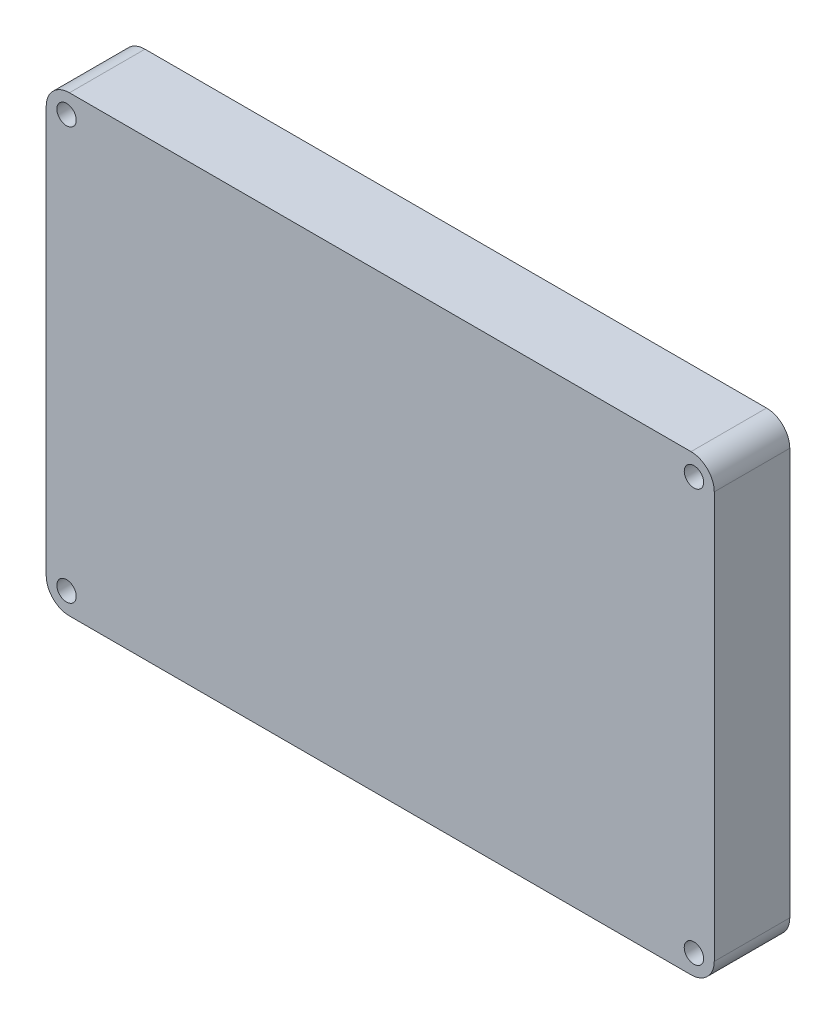
ISO-10303-21;
HEADER;
FILE_DESCRIPTION(('STEP AP214'),'2;1');
FILE_NAME('part.step','',(''),(''),'','','');
FILE_SCHEMA(('AUTOMOTIVE_DESIGN { 1 0 10303 214 1 1 1 1 }'));
ENDSEC;
DATA;
#1=APPLICATION_CONTEXT('core data for automotive mechanical design processes');
#2=APPLICATION_PROTOCOL_DEFINITION('international standard','automotive_design',2000,#1);
#3=PRODUCT_CONTEXT('',#1,'mechanical');
#4=PRODUCT('Part','Part','',(#3));
#5=PRODUCT_RELATED_PRODUCT_CATEGORY('part','',(#4));
#6=PRODUCT_DEFINITION_FORMATION('','',#4);
#7=PRODUCT_DEFINITION_CONTEXT('part definition',#1,'design');
#8=PRODUCT_DEFINITION('design','',#6,#7);
#9=PRODUCT_DEFINITION_SHAPE('','',#8);
#10=(LENGTH_UNIT() NAMED_UNIT(*) SI_UNIT(.MILLI.,.METRE.));
#11=(NAMED_UNIT(*) PLANE_ANGLE_UNIT() SI_UNIT($,.RADIAN.));
#12=(NAMED_UNIT(*) SI_UNIT($,.STERADIAN.) SOLID_ANGLE_UNIT());
#13=UNCERTAINTY_MEASURE_WITH_UNIT(LENGTH_MEASURE(1.E-05),#10,'distance_accuracy_value','');
#14=(GEOMETRIC_REPRESENTATION_CONTEXT(3) GLOBAL_UNCERTAINTY_ASSIGNED_CONTEXT((#13)) GLOBAL_UNIT_ASSIGNED_CONTEXT((#10,
#11,#12)) REPRESENTATION_CONTEXT('',''));
#15=CARTESIAN_POINT('',(0.,0.,0.));
#16=DIRECTION('',(0.,0.,1.));
#17=DIRECTION('',(1.,0.,0.));
#18=AXIS2_PLACEMENT_3D('',#15,#16,#17);
#19=CARTESIAN_POINT('',(0.,0.,13.));
#20=DIRECTION('',(0.,0.,1.));
#21=DIRECTION('',(1.,0.,0.));
#22=AXIS2_PLACEMENT_3D('',#19,#20,#21);
#23=PLANE('',#22);
#24=CARTESIAN_POINT('',(-3.50000000000003,3.49999999999999,13.));
#25=DIRECTION('',(0.,0.,1.));
#26=DIRECTION('',(1.,0.,0.));
#27=AXIS2_PLACEMENT_3D('',#24,#25,#26);
#28=CIRCLE('',#27,1.67000000000001);
#29=CARTESIAN_POINT('',(-5.17000000000004,3.49999999999999,13.));
#30=VERTEX_POINT('',#29);
#31=EDGE_CURVE('E190',#30,#30,#28,.T.);
#32=ORIENTED_EDGE('',*,*,#31,.F.);
#33=EDGE_LOOP('',(#32));
#34=FACE_BOUND('',#33,.T.);
#35=CARTESIAN_POINT('',(-111.5,74.5,13.));
#36=DIRECTION('',(0.,0.,1.));
#37=DIRECTION('',(1.,0.,0.));
#38=AXIS2_PLACEMENT_3D('',#35,#36,#37);
#39=CIRCLE('',#38,1.67000000000001);
#40=CARTESIAN_POINT('',(-113.17,74.5,13.));
#41=VERTEX_POINT('',#40);
#42=EDGE_CURVE('E136',#41,#41,#39,.T.);
#43=ORIENTED_EDGE('',*,*,#42,.F.);
#44=EDGE_LOOP('',(#43));
#45=FACE_BOUND('',#44,.T.);
#46=DIRECTION('',(0.,-1.,0.));
#47=VECTOR('',#46,1.);
#48=CARTESIAN_POINT('',(-115.,78.,13.));
#49=LINE('',#48,#47);
#50=CARTESIAN_POINT('',(-115.,74.,13.));
#51=VERTEX_POINT('',#50);
#52=CARTESIAN_POINT('',(-115.,4.,13.));
#53=VERTEX_POINT('',#52);
#54=EDGE_CURVE('E141',#51,#53,#49,.T.);
#55=ORIENTED_EDGE('',*,*,#54,.T.);
#56=CARTESIAN_POINT('',(-111.,4.,13.));
#57=DIRECTION('',(0.,0.,1.));
#58=DIRECTION('',(1.,0.,0.));
#59=AXIS2_PLACEMENT_3D('',#56,#57,#58);
#60=CIRCLE('',#59,4.);
#61=CARTESIAN_POINT('',(-111.,0.,13.));
#62=VERTEX_POINT('',#61);
#63=EDGE_CURVE('E156',#53,#62,#60,.T.);
#64=ORIENTED_EDGE('',*,*,#63,.T.);
#65=DIRECTION('',(1.,0.,0.));
#66=VECTOR('',#65,1.);
#67=CARTESIAN_POINT('',(-115.,0.,13.));
#68=LINE('',#67,#66);
#69=CARTESIAN_POINT('',(-4.00000000000003,0.,13.));
#70=VERTEX_POINT('',#69);
#71=EDGE_CURVE('E123',#62,#70,#68,.T.);
#72=ORIENTED_EDGE('',*,*,#71,.T.);
#73=CARTESIAN_POINT('',(-4.,4.,13.));
#74=DIRECTION('',(0.,0.,1.));
#75=DIRECTION('',(1.,0.,0.));
#76=AXIS2_PLACEMENT_3D('',#73,#74,#75);
#77=CIRCLE('',#76,4.);
#78=CARTESIAN_POINT('',(0.,4.,13.));
#79=VERTEX_POINT('',#78);
#80=EDGE_CURVE('E154',#70,#79,#77,.T.);
#81=ORIENTED_EDGE('',*,*,#80,.T.);
#82=DIRECTION('',(0.,1.,0.));
#83=VECTOR('',#82,1.);
#84=CARTESIAN_POINT('',(0.,78.,13.));
#85=LINE('',#84,#83);
#86=CARTESIAN_POINT('',(0.,74.,13.));
#87=VERTEX_POINT('',#86);
#88=EDGE_CURVE('E167',#79,#87,#85,.T.);
#89=ORIENTED_EDGE('',*,*,#88,.T.);
#90=CARTESIAN_POINT('',(-4.,74.,13.));
#91=DIRECTION('',(0.,0.,1.));
#92=DIRECTION('',(1.,0.,0.));
#93=AXIS2_PLACEMENT_3D('',#90,#91,#92);
#94=CIRCLE('',#93,4.);
#95=CARTESIAN_POINT('',(-4.00000000000003,78.,13.));
#96=VERTEX_POINT('',#95);
#97=EDGE_CURVE('E58',#87,#96,#94,.T.);
#98=ORIENTED_EDGE('',*,*,#97,.T.);
#99=DIRECTION('',(-1.,0.,0.));
#100=VECTOR('',#99,1.);
#101=CARTESIAN_POINT('',(-115.,78.,13.));
#102=LINE('',#101,#100);
#103=CARTESIAN_POINT('',(-111.,78.,13.));
#104=VERTEX_POINT('',#103);
#105=EDGE_CURVE('E142',#96,#104,#102,.T.);
#106=ORIENTED_EDGE('',*,*,#105,.T.);
#107=CARTESIAN_POINT('',(-111.,74.,13.));
#108=DIRECTION('',(0.,0.,1.));
#109=DIRECTION('',(1.,0.,0.));
#110=AXIS2_PLACEMENT_3D('',#107,#108,#109);
#111=CIRCLE('',#110,4.);
#112=EDGE_CURVE('E151',#104,#51,#111,.T.);
#113=ORIENTED_EDGE('',*,*,#112,.T.);
#114=EDGE_LOOP('',(#55,#64,#72,#81,#89,#98,#106,#113));
#115=FACE_BOUND('',#114,.T.);
#116=CARTESIAN_POINT('',(-3.50000000000003,74.5,13.));
#117=DIRECTION('',(0.,0.,1.));
#118=DIRECTION('',(-1.,0.,0.));
#119=AXIS2_PLACEMENT_3D('',#116,#117,#118);
#120=CIRCLE('',#119,1.67000000000001);
#121=CARTESIAN_POINT('',(-5.17000000000004,74.5,13.));
#122=VERTEX_POINT('',#121);
#123=EDGE_CURVE('E184',#122,#122,#120,.T.);
#124=ORIENTED_EDGE('',*,*,#123,.F.);
#125=EDGE_LOOP('',(#124));
#126=FACE_BOUND('',#125,.T.);
#127=CARTESIAN_POINT('',(-111.5,3.5,13.));
#128=DIRECTION('',(0.,0.,1.));
#129=DIRECTION('',(-1.,0.,0.));
#130=AXIS2_PLACEMENT_3D('',#127,#128,#129);
#131=CIRCLE('',#130,1.67000000000001);
#132=CARTESIAN_POINT('',(-113.17,3.5,13.));
#133=VERTEX_POINT('',#132);
#134=EDGE_CURVE('E196',#133,#133,#131,.T.);
#135=ORIENTED_EDGE('',*,*,#134,.F.);
#136=EDGE_LOOP('',(#135));
#137=FACE_BOUND('',#136,.T.);
#138=ADVANCED_FACE('F37',(#34,#45,#115,#126,#137),#23,.T.);
#139=CARTESIAN_POINT('',(0.,0.,0.));
#140=DIRECTION('',(0.,0.,1.));
#141=DIRECTION('',(1.,0.,0.));
#142=AXIS2_PLACEMENT_3D('',#139,#140,#141);
#143=PLANE('',#142);
#144=DIRECTION('',(1.,0.,0.));
#145=VECTOR('',#144,1.);
#146=CARTESIAN_POINT('',(-115.,0.,0.));
#147=LINE('',#146,#145);
#148=CARTESIAN_POINT('',(-111.,0.,0.));
#149=VERTEX_POINT('',#148);
#150=CARTESIAN_POINT('',(-4.00000000000003,0.,0.));
#151=VERTEX_POINT('',#150);
#152=EDGE_CURVE('E120',#149,#151,#147,.T.);
#153=ORIENTED_EDGE('',*,*,#152,.F.);
#154=CARTESIAN_POINT('',(-111.,4.,0.));
#155=DIRECTION('',(0.,0.,1.));
#156=DIRECTION('',(1.,0.,0.));
#157=AXIS2_PLACEMENT_3D('',#154,#155,#156);
#158=CIRCLE('',#157,4.);
#159=CARTESIAN_POINT('',(-115.,4.,0.));
#160=VERTEX_POINT('',#159);
#161=EDGE_CURVE('E103',#149,#160,#158,.F.);
#162=ORIENTED_EDGE('',*,*,#161,.T.);
#163=DIRECTION('',(0.,-1.,0.));
#164=VECTOR('',#163,1.);
#165=CARTESIAN_POINT('',(-115.,78.,0.));
#166=LINE('',#165,#164);
#167=CARTESIAN_POINT('',(-115.,74.,0.));
#168=VERTEX_POINT('',#167);
#169=EDGE_CURVE('E131',#168,#160,#166,.T.);
#170=ORIENTED_EDGE('',*,*,#169,.F.);
#171=CARTESIAN_POINT('',(-111.,74.,0.));
#172=DIRECTION('',(0.,0.,1.));
#173=DIRECTION('',(1.,0.,0.));
#174=AXIS2_PLACEMENT_3D('',#171,#172,#173);
#175=CIRCLE('',#174,4.);
#176=CARTESIAN_POINT('',(-111.,78.,0.));
#177=VERTEX_POINT('',#176);
#178=EDGE_CURVE('E124',#168,#177,#175,.F.);
#179=ORIENTED_EDGE('',*,*,#178,.T.);
#180=DIRECTION('',(-1.,0.,0.));
#181=VECTOR('',#180,1.);
#182=CARTESIAN_POINT('',(-115.,78.,0.));
#183=LINE('',#182,#181);
#184=CARTESIAN_POINT('',(-4.00000000000003,78.,0.));
#185=VERTEX_POINT('',#184);
#186=EDGE_CURVE('E134',#185,#177,#183,.T.);
#187=ORIENTED_EDGE('',*,*,#186,.F.);
#188=CARTESIAN_POINT('',(-4.,74.,0.));
#189=DIRECTION('',(0.,0.,1.));
#190=DIRECTION('',(1.,0.,0.));
#191=AXIS2_PLACEMENT_3D('',#188,#189,#190);
#192=CIRCLE('',#191,4.);
#193=CARTESIAN_POINT('',(0.,74.,0.));
#194=VERTEX_POINT('',#193);
#195=EDGE_CURVE('E145',#185,#194,#192,.F.);
#196=ORIENTED_EDGE('',*,*,#195,.T.);
#197=DIRECTION('',(0.,1.,0.));
#198=VECTOR('',#197,1.);
#199=CARTESIAN_POINT('',(0.,78.,0.));
#200=LINE('',#199,#198);
#201=CARTESIAN_POINT('',(0.,4.,0.));
#202=VERTEX_POINT('',#201);
#203=EDGE_CURVE('E130',#202,#194,#200,.T.);
#204=ORIENTED_EDGE('',*,*,#203,.F.);
#205=CARTESIAN_POINT('',(-4.,4.,0.));
#206=DIRECTION('',(0.,0.,1.));
#207=DIRECTION('',(1.,0.,0.));
#208=AXIS2_PLACEMENT_3D('',#205,#206,#207);
#209=CIRCLE('',#208,4.);
#210=EDGE_CURVE('E114',#202,#151,#209,.F.);
#211=ORIENTED_EDGE('',*,*,#210,.T.);
#212=EDGE_LOOP('',(#153,#162,#170,#179,#187,#196,#204,#211));
#213=FACE_BOUND('',#212,.T.);
#214=CARTESIAN_POINT('',(-111.5,74.5,0.));
#215=DIRECTION('',(0.,0.,1.));
#216=DIRECTION('',(1.,0.,0.));
#217=AXIS2_PLACEMENT_3D('',#214,#215,#216);
#218=CIRCLE('',#217,1.67000000000001);
#219=CARTESIAN_POINT('',(-113.17,74.5,0.));
#220=VERTEX_POINT('',#219);
#221=EDGE_CURVE('E181',#220,#220,#218,.T.);
#222=ORIENTED_EDGE('',*,*,#221,.T.);
#223=EDGE_LOOP('',(#222));
#224=FACE_BOUND('',#223,.T.);
#225=CARTESIAN_POINT('',(-3.50000000000003,74.5,0.));
#226=DIRECTION('',(0.,0.,1.));
#227=DIRECTION('',(-1.,0.,0.));
#228=AXIS2_PLACEMENT_3D('',#225,#226,#227);
#229=CIRCLE('',#228,1.67000000000001);
#230=CARTESIAN_POINT('',(-5.17000000000004,74.5,0.));
#231=VERTEX_POINT('',#230);
#232=EDGE_CURVE('E187',#231,#231,#229,.T.);
#233=ORIENTED_EDGE('',*,*,#232,.T.);
#234=EDGE_LOOP('',(#233));
#235=FACE_BOUND('',#234,.T.);
#236=CARTESIAN_POINT('',(-3.50000000000003,3.49999999999999,0.));
#237=DIRECTION('',(0.,0.,1.));
#238=DIRECTION('',(1.,0.,0.));
#239=AXIS2_PLACEMENT_3D('',#236,#237,#238);
#240=CIRCLE('',#239,1.67000000000001);
#241=CARTESIAN_POINT('',(-5.17000000000004,3.49999999999999,0.));
#242=VERTEX_POINT('',#241);
#243=EDGE_CURVE('E193',#242,#242,#240,.T.);
#244=ORIENTED_EDGE('',*,*,#243,.T.);
#245=EDGE_LOOP('',(#244));
#246=FACE_BOUND('',#245,.T.);
#247=CARTESIAN_POINT('',(-111.5,3.5,0.));
#248=DIRECTION('',(0.,0.,1.));
#249=DIRECTION('',(-1.,0.,0.));
#250=AXIS2_PLACEMENT_3D('',#247,#248,#249);
#251=CIRCLE('',#250,1.67000000000001);
#252=CARTESIAN_POINT('',(-113.17,3.5,0.));
#253=VERTEX_POINT('',#252);
#254=EDGE_CURVE('E199',#253,#253,#251,.T.);
#255=ORIENTED_EDGE('',*,*,#254,.T.);
#256=EDGE_LOOP('',(#255));
#257=FACE_BOUND('',#256,.T.);
#258=ADVANCED_FACE('F127',(#213,#224,#235,#246,#257),#143,.F.);
#259=CARTESIAN_POINT('',(-115.,78.,13.));
#260=DIRECTION('',(1.,0.,0.));
#261=DIRECTION('',(0.,0.,-1.));
#262=AXIS2_PLACEMENT_3D('',#259,#260,#261);
#263=PLANE('',#262);
#264=ORIENTED_EDGE('',*,*,#169,.T.);
#265=DIRECTION('',(0.,0.,-1.));
#266=VECTOR('',#265,1.);
#267=CARTESIAN_POINT('',(-115.,4.,13.));
#268=LINE('',#267,#266);
#269=EDGE_CURVE('E108',#160,#53,#268,.F.);
#270=ORIENTED_EDGE('',*,*,#269,.T.);
#271=ORIENTED_EDGE('',*,*,#54,.F.);
#272=DIRECTION('',(0.,0.,-1.));
#273=VECTOR('',#272,1.);
#274=CARTESIAN_POINT('',(-115.,74.,13.));
#275=LINE('',#274,#273);
#276=EDGE_CURVE('E113',#51,#168,#275,.T.);
#277=ORIENTED_EDGE('',*,*,#276,.T.);
#278=EDGE_LOOP('',(#264,#270,#271,#277));
#279=FACE_BOUND('',#278,.T.);
#280=ADVANCED_FACE('F214',(#279),#263,.F.);
#281=CARTESIAN_POINT('',(-115.,0.,13.));
#282=DIRECTION('',(0.,1.,0.));
#283=DIRECTION('',(0.,0.,1.));
#284=AXIS2_PLACEMENT_3D('',#281,#282,#283);
#285=PLANE('',#284);
#286=ORIENTED_EDGE('',*,*,#71,.F.);
#287=DIRECTION('',(0.,0.,-1.));
#288=VECTOR('',#287,1.);
#289=CARTESIAN_POINT('',(-111.,0.,13.));
#290=LINE('',#289,#288);
#291=EDGE_CURVE('E107',#62,#149,#290,.T.);
#292=ORIENTED_EDGE('',*,*,#291,.T.);
#293=ORIENTED_EDGE('',*,*,#152,.T.);
#294=DIRECTION('',(0.,0.,-1.));
#295=VECTOR('',#294,1.);
#296=CARTESIAN_POINT('',(-4.,0.,13.));
#297=LINE('',#296,#295);
#298=EDGE_CURVE('E125',#151,#70,#297,.F.);
#299=ORIENTED_EDGE('',*,*,#298,.T.);
#300=EDGE_LOOP('',(#286,#292,#293,#299));
#301=FACE_BOUND('',#300,.T.);
#302=ADVANCED_FACE('F119',(#301),#285,.F.);
#303=CARTESIAN_POINT('',(0.,78.,13.));
#304=DIRECTION('',(-1.,0.,0.));
#305=DIRECTION('',(0.,0.,1.));
#306=AXIS2_PLACEMENT_3D('',#303,#304,#305);
#307=PLANE('',#306);
#308=ORIENTED_EDGE('',*,*,#88,.F.);
#309=DIRECTION('',(0.,0.,-1.));
#310=VECTOR('',#309,1.);
#311=CARTESIAN_POINT('',(0.,4.,13.));
#312=LINE('',#311,#310);
#313=EDGE_CURVE('E160',#79,#202,#312,.T.);
#314=ORIENTED_EDGE('',*,*,#313,.T.);
#315=ORIENTED_EDGE('',*,*,#203,.T.);
#316=DIRECTION('',(0.,0.,-1.));
#317=VECTOR('',#316,1.);
#318=CARTESIAN_POINT('',(0.,74.,13.));
#319=LINE('',#318,#317);
#320=EDGE_CURVE('E158',#194,#87,#319,.F.);
#321=ORIENTED_EDGE('',*,*,#320,.T.);
#322=EDGE_LOOP('',(#308,#314,#315,#321));
#323=FACE_BOUND('',#322,.T.);
#324=ADVANCED_FACE('F165',(#323),#307,.F.);
#325=CARTESIAN_POINT('',(-115.,78.,13.));
#326=DIRECTION('',(0.,-1.,0.));
#327=DIRECTION('',(0.,0.,-1.));
#328=AXIS2_PLACEMENT_3D('',#325,#326,#327);
#329=PLANE('',#328);
#330=ORIENTED_EDGE('',*,*,#105,.F.);
#331=DIRECTION('',(0.,0.,-1.));
#332=VECTOR('',#331,1.);
#333=CARTESIAN_POINT('',(-4.,78.,13.));
#334=LINE('',#333,#332);
#335=EDGE_CURVE('E11',#96,#185,#334,.T.);
#336=ORIENTED_EDGE('',*,*,#335,.T.);
#337=ORIENTED_EDGE('',*,*,#186,.T.);
#338=DIRECTION('',(0.,0.,-1.));
#339=VECTOR('',#338,1.);
#340=CARTESIAN_POINT('',(-111.,78.,13.));
#341=LINE('',#340,#339);
#342=EDGE_CURVE('E45',#177,#104,#341,.F.);
#343=ORIENTED_EDGE('',*,*,#342,.T.);
#344=EDGE_LOOP('',(#330,#336,#337,#343));
#345=FACE_BOUND('',#344,.T.);
#346=ADVANCED_FACE('F174',(#345),#329,.F.);
#347=CARTESIAN_POINT('',(-111.5,74.5,13.));
#348=DIRECTION('',(0.,0.,-1.));
#349=DIRECTION('',(-1.,0.,0.));
#350=AXIS2_PLACEMENT_3D('',#347,#348,#349);
#351=CYLINDRICAL_SURFACE('',#350,1.67000000000001);
#352=CARTESIAN_POINT('',(-113.17,74.5,13.));
#353=CARTESIAN_POINT('',(-113.17,74.5,12.8645833333333));
#354=CARTESIAN_POINT('',(-113.17,74.5,12.7291666666667));
#355=CARTESIAN_POINT('',(-113.17,74.5,12.4583333333333));
#356=CARTESIAN_POINT('',(-113.17,74.5,12.3229166666667));
#357=CARTESIAN_POINT('',(-113.17,74.5,12.0520833333333));
#358=CARTESIAN_POINT('',(-113.17,74.5,11.9166666666667));
#359=CARTESIAN_POINT('',(-113.17,74.5,11.6458333333333));
#360=CARTESIAN_POINT('',(-113.17,74.5,11.5104166666667));
#361=CARTESIAN_POINT('',(-113.17,74.5,11.2395833333333));
#362=CARTESIAN_POINT('',(-113.17,74.5,11.1041666666667));
#363=CARTESIAN_POINT('',(-113.17,74.5,10.8333333333333));
#364=CARTESIAN_POINT('',(-113.17,74.5,10.6979166666667));
#365=CARTESIAN_POINT('',(-113.17,74.5,10.4270833333333));
#366=CARTESIAN_POINT('',(-113.17,74.5,10.2916666666667));
#367=CARTESIAN_POINT('',(-113.17,74.5,10.0208333333333));
#368=CARTESIAN_POINT('',(-113.17,74.5,9.88541666666667));
#369=CARTESIAN_POINT('',(-113.17,74.5,9.61458333333333));
#370=CARTESIAN_POINT('',(-113.17,74.5,9.47916666666667));
#371=CARTESIAN_POINT('',(-113.17,74.5,9.20833333333333));
#372=CARTESIAN_POINT('',(-113.17,74.5,9.07291666666666));
#373=CARTESIAN_POINT('',(-113.17,74.5,8.80208333333333));
#374=CARTESIAN_POINT('',(-113.17,74.5,8.66666666666667));
#375=CARTESIAN_POINT('',(-113.17,74.5,8.39583333333333));
#376=CARTESIAN_POINT('',(-113.17,74.5,8.26041666666667));
#377=CARTESIAN_POINT('',(-113.17,74.5,7.98958333333333));
#378=CARTESIAN_POINT('',(-113.17,74.5,7.85416666666667));
#379=CARTESIAN_POINT('',(-113.17,74.5,7.58333333333333));
#380=CARTESIAN_POINT('',(-113.17,74.5,7.44791666666667));
#381=CARTESIAN_POINT('',(-113.17,74.5,7.17708333333333));
#382=CARTESIAN_POINT('',(-113.17,74.5,7.04166666666667));
#383=CARTESIAN_POINT('',(-113.17,74.5,6.77083333333333));
#384=CARTESIAN_POINT('',(-113.17,74.5,6.63541666666667));
#385=CARTESIAN_POINT('',(-113.17,74.5,6.36458333333333));
#386=CARTESIAN_POINT('',(-113.17,74.5,6.22916666666667));
#387=CARTESIAN_POINT('',(-113.17,74.5,5.95833333333333));
#388=CARTESIAN_POINT('',(-113.17,74.5,5.82291666666667));
#389=CARTESIAN_POINT('',(-113.17,74.5,5.55208333333333));
#390=CARTESIAN_POINT('',(-113.17,74.5,5.41666666666667));
#391=CARTESIAN_POINT('',(-113.17,74.5,5.14583333333333));
#392=CARTESIAN_POINT('',(-113.17,74.5,5.01041666666667));
#393=CARTESIAN_POINT('',(-113.17,74.5,4.73958333333333));
#394=CARTESIAN_POINT('',(-113.17,74.5,4.60416666666667));
#395=CARTESIAN_POINT('',(-113.17,74.5,4.33333333333333));
#396=CARTESIAN_POINT('',(-113.17,74.5,4.19791666666667));
#397=CARTESIAN_POINT('',(-113.17,74.5,3.92708333333333));
#398=CARTESIAN_POINT('',(-113.17,74.5,3.79166666666667));
#399=CARTESIAN_POINT('',(-113.17,74.5,3.52083333333333));
#400=CARTESIAN_POINT('',(-113.17,74.5,3.38541666666667));
#401=CARTESIAN_POINT('',(-113.17,74.5,3.11458333333333));
#402=CARTESIAN_POINT('',(-113.17,74.5,2.97916666666667));
#403=CARTESIAN_POINT('',(-113.17,74.5,2.70833333333333));
#404=CARTESIAN_POINT('',(-113.17,74.5,2.57291666666667));
#405=CARTESIAN_POINT('',(-113.17,74.5,2.30208333333333));
#406=CARTESIAN_POINT('',(-113.17,74.5,2.16666666666667));
#407=CARTESIAN_POINT('',(-113.17,74.5,1.89583333333333));
#408=CARTESIAN_POINT('',(-113.17,74.5,1.76041666666667));
#409=CARTESIAN_POINT('',(-113.17,74.5,1.48958333333333));
#410=CARTESIAN_POINT('',(-113.17,74.5,1.35416666666667));
#411=CARTESIAN_POINT('',(-113.17,74.5,1.08333333333333));
#412=CARTESIAN_POINT('',(-113.17,74.5,0.947916666666667));
#413=CARTESIAN_POINT('',(-113.17,74.5,0.677083333333334));
#414=CARTESIAN_POINT('',(-113.17,74.5,0.541666666666667));
#415=CARTESIAN_POINT('',(-113.17,74.5,0.270833333333334));
#416=CARTESIAN_POINT('',(-113.17,74.5,0.135416666666667));
#417=CARTESIAN_POINT('',(-113.17,74.5,0.));
#418=B_SPLINE_CURVE_WITH_KNOTS('',3,(#352,#353,#354,#355,#356,#357,#358,#359,#360,#361,#362,
#363,#364,#365,#366,#367,#368,#369,#370,#371,#372,#373,#374,#375,#376,#377,#378,#379,#380,#381,
#382,#383,#384,#385,#386,#387,#388,#389,#390,#391,#392,#393,#394,#395,#396,#397,#398,#399,#400,
#401,#402,#403,#404,#405,#406,#407,#408,#409,#410,#411,#412,#413,#414,#415,#416,#417),
.UNSPECIFIED.,.F.,.F.,(4,2,2,2,2,2,2,2,2,2,2,2,2,2,2,2,2,2,2,2,2,2,2,2,2,2,2,2,2,2,2,2,4),(0.,
0.40625,0.812500000000001,1.21875,1.625,2.03125,2.4375,2.84375,3.25,3.65625,4.0625,4.46875,
4.875,5.28125,5.6875,6.09375,6.5,6.90625,7.3125,7.71875,8.125,8.53125,8.9375,9.34375,9.75,
10.15625,10.5625,10.96875,11.375,11.78125,12.1875,12.59375,13.),.UNSPECIFIED.);
#419=EDGE_CURVE('BSEAM219',#41,#220,#418,.T.);
#420=ORIENTED_EDGE('',*,*,#42,.T.);
#421=ORIENTED_EDGE('',*,*,#221,.F.);
#422=ORIENTED_EDGE('',*,*,#419,.T.);
#423=ORIENTED_EDGE('',*,*,#419,.F.);
#424=EDGE_LOOP('',(#420,#422,#421,#423));
#425=FACE_BOUND('',#424,.T.);
#426=ADVANCED_FACE('F219',(#425),#351,.F.);
#427=CARTESIAN_POINT('',(-3.50000000000003,74.5,13.));
#428=DIRECTION('',(0.,0.,-1.));
#429=DIRECTION('',(-1.,0.,0.));
#430=AXIS2_PLACEMENT_3D('',#427,#428,#429);
#431=CYLINDRICAL_SURFACE('',#430,1.67000000000001);
#432=CARTESIAN_POINT('',(-5.17000000000004,74.5,13.));
#433=CARTESIAN_POINT('',(-5.17000000000004,74.5,12.8645833333333));
#434=CARTESIAN_POINT('',(-5.17000000000004,74.5,12.7291666666667));
#435=CARTESIAN_POINT('',(-5.17000000000004,74.5,12.4583333333333));
#436=CARTESIAN_POINT('',(-5.17000000000004,74.5,12.3229166666667));
#437=CARTESIAN_POINT('',(-5.17000000000004,74.5,12.0520833333333));
#438=CARTESIAN_POINT('',(-5.17000000000004,74.5,11.9166666666667));
#439=CARTESIAN_POINT('',(-5.17000000000004,74.5,11.6458333333333));
#440=CARTESIAN_POINT('',(-5.17000000000004,74.5,11.5104166666667));
#441=CARTESIAN_POINT('',(-5.17000000000004,74.5,11.2395833333333));
#442=CARTESIAN_POINT('',(-5.17000000000004,74.5,11.1041666666667));
#443=CARTESIAN_POINT('',(-5.17000000000004,74.5,10.8333333333333));
#444=CARTESIAN_POINT('',(-5.17000000000004,74.5,10.6979166666667));
#445=CARTESIAN_POINT('',(-5.17000000000004,74.5,10.4270833333333));
#446=CARTESIAN_POINT('',(-5.17000000000004,74.5,10.2916666666667));
#447=CARTESIAN_POINT('',(-5.17000000000004,74.5,10.0208333333333));
#448=CARTESIAN_POINT('',(-5.17000000000004,74.5,9.88541666666667));
#449=CARTESIAN_POINT('',(-5.17000000000004,74.5,9.61458333333333));
#450=CARTESIAN_POINT('',(-5.17000000000004,74.5,9.47916666666667));
#451=CARTESIAN_POINT('',(-5.17000000000004,74.5,9.20833333333333));
#452=CARTESIAN_POINT('',(-5.17000000000004,74.5,9.07291666666666));
#453=CARTESIAN_POINT('',(-5.17000000000004,74.5,8.80208333333333));
#454=CARTESIAN_POINT('',(-5.17000000000004,74.5,8.66666666666667));
#455=CARTESIAN_POINT('',(-5.17000000000004,74.5,8.39583333333333));
#456=CARTESIAN_POINT('',(-5.17000000000004,74.5,8.26041666666667));
#457=CARTESIAN_POINT('',(-5.17000000000004,74.5,7.98958333333333));
#458=CARTESIAN_POINT('',(-5.17000000000004,74.5,7.85416666666667));
#459=CARTESIAN_POINT('',(-5.17000000000004,74.5,7.58333333333333));
#460=CARTESIAN_POINT('',(-5.17000000000004,74.5,7.44791666666667));
#461=CARTESIAN_POINT('',(-5.17000000000004,74.5,7.17708333333333));
#462=CARTESIAN_POINT('',(-5.17000000000004,74.5,7.04166666666667));
#463=CARTESIAN_POINT('',(-5.17000000000004,74.5,6.77083333333333));
#464=CARTESIAN_POINT('',(-5.17000000000004,74.5,6.63541666666667));
#465=CARTESIAN_POINT('',(-5.17000000000004,74.5,6.36458333333333));
#466=CARTESIAN_POINT('',(-5.17000000000004,74.5,6.22916666666667));
#467=CARTESIAN_POINT('',(-5.17000000000004,74.5,5.95833333333333));
#468=CARTESIAN_POINT('',(-5.17000000000004,74.5,5.82291666666667));
#469=CARTESIAN_POINT('',(-5.17000000000004,74.5,5.55208333333333));
#470=CARTESIAN_POINT('',(-5.17000000000004,74.5,5.41666666666667));
#471=CARTESIAN_POINT('',(-5.17000000000004,74.5,5.14583333333333));
#472=CARTESIAN_POINT('',(-5.17000000000004,74.5,5.01041666666667));
#473=CARTESIAN_POINT('',(-5.17000000000004,74.5,4.73958333333333));
#474=CARTESIAN_POINT('',(-5.17000000000004,74.5,4.60416666666667));
#475=CARTESIAN_POINT('',(-5.17000000000004,74.5,4.33333333333333));
#476=CARTESIAN_POINT('',(-5.17000000000004,74.5,4.19791666666667));
#477=CARTESIAN_POINT('',(-5.17000000000004,74.5,3.92708333333333));
#478=CARTESIAN_POINT('',(-5.17000000000004,74.5,3.79166666666667));
#479=CARTESIAN_POINT('',(-5.17000000000004,74.5,3.52083333333333));
#480=CARTESIAN_POINT('',(-5.17000000000004,74.5,3.38541666666667));
#481=CARTESIAN_POINT('',(-5.17000000000004,74.5,3.11458333333333));
#482=CARTESIAN_POINT('',(-5.17000000000004,74.5,2.97916666666667));
#483=CARTESIAN_POINT('',(-5.17000000000004,74.5,2.70833333333333));
#484=CARTESIAN_POINT('',(-5.17000000000004,74.5,2.57291666666667));
#485=CARTESIAN_POINT('',(-5.17000000000004,74.5,2.30208333333333));
#486=CARTESIAN_POINT('',(-5.17000000000004,74.5,2.16666666666667));
#487=CARTESIAN_POINT('',(-5.17000000000004,74.5,1.89583333333333));
#488=CARTESIAN_POINT('',(-5.17000000000004,74.5,1.76041666666667));
#489=CARTESIAN_POINT('',(-5.17000000000004,74.5,1.48958333333333));
#490=CARTESIAN_POINT('',(-5.17000000000004,74.5,1.35416666666667));
#491=CARTESIAN_POINT('',(-5.17000000000004,74.5,1.08333333333333));
#492=CARTESIAN_POINT('',(-5.17000000000004,74.5,0.947916666666667));
#493=CARTESIAN_POINT('',(-5.17000000000004,74.5,0.677083333333334));
#494=CARTESIAN_POINT('',(-5.17000000000004,74.5,0.541666666666667));
#495=CARTESIAN_POINT('',(-5.17000000000004,74.5,0.270833333333334));
#496=CARTESIAN_POINT('',(-5.17000000000004,74.5,0.135416666666667));
#497=CARTESIAN_POINT('',(-5.17000000000004,74.5,0.));
#498=B_SPLINE_CURVE_WITH_KNOTS('',3,(#432,#433,#434,#435,#436,#437,#438,#439,#440,#441,#442,
#443,#444,#445,#446,#447,#448,#449,#450,#451,#452,#453,#454,#455,#456,#457,#458,#459,#460,#461,
#462,#463,#464,#465,#466,#467,#468,#469,#470,#471,#472,#473,#474,#475,#476,#477,#478,#479,#480,
#481,#482,#483,#484,#485,#486,#487,#488,#489,#490,#491,#492,#493,#494,#495,#496,#497),
.UNSPECIFIED.,.F.,.F.,(4,2,2,2,2,2,2,2,2,2,2,2,2,2,2,2,2,2,2,2,2,2,2,2,2,2,2,2,2,2,2,2,4),(0.,
0.40625,0.812500000000001,1.21875,1.625,2.03125,2.4375,2.84375,3.25,3.65625,4.0625,4.46875,
4.875,5.28125,5.6875,6.09375,6.5,6.90625,7.3125,7.71875,8.125,8.53125,8.9375,9.34375,9.75,
10.15625,10.5625,10.96875,11.375,11.78125,12.1875,12.59375,13.),.UNSPECIFIED.);
#499=EDGE_CURVE('BSEAM247',#122,#231,#498,.T.);
#500=ORIENTED_EDGE('',*,*,#123,.T.);
#501=ORIENTED_EDGE('',*,*,#232,.F.);
#502=ORIENTED_EDGE('',*,*,#499,.T.);
#503=ORIENTED_EDGE('',*,*,#499,.F.);
#504=EDGE_LOOP('',(#500,#502,#501,#503));
#505=FACE_BOUND('',#504,.T.);
#506=ADVANCED_FACE('F247',(#505),#431,.F.);
#507=CARTESIAN_POINT('',(-3.50000000000003,3.49999999999999,13.));
#508=DIRECTION('',(0.,0.,-1.));
#509=DIRECTION('',(-1.,0.,0.));
#510=AXIS2_PLACEMENT_3D('',#507,#508,#509);
#511=CYLINDRICAL_SURFACE('',#510,1.67000000000001);
#512=CARTESIAN_POINT('',(-5.17000000000004,3.49999999999999,13.));
#513=CARTESIAN_POINT('',(-5.17000000000004,3.49999999999999,12.8645833333333));
#514=CARTESIAN_POINT('',(-5.17000000000004,3.49999999999999,12.7291666666667));
#515=CARTESIAN_POINT('',(-5.17000000000004,3.49999999999999,12.4583333333333));
#516=CARTESIAN_POINT('',(-5.17000000000004,3.49999999999999,12.3229166666667));
#517=CARTESIAN_POINT('',(-5.17000000000004,3.49999999999999,12.0520833333333));
#518=CARTESIAN_POINT('',(-5.17000000000004,3.49999999999999,11.9166666666667));
#519=CARTESIAN_POINT('',(-5.17000000000004,3.49999999999999,11.6458333333333));
#520=CARTESIAN_POINT('',(-5.17000000000004,3.49999999999999,11.5104166666667));
#521=CARTESIAN_POINT('',(-5.17000000000004,3.49999999999999,11.2395833333333));
#522=CARTESIAN_POINT('',(-5.17000000000004,3.49999999999999,11.1041666666667));
#523=CARTESIAN_POINT('',(-5.17000000000004,3.49999999999999,10.8333333333333));
#524=CARTESIAN_POINT('',(-5.17000000000004,3.49999999999999,10.6979166666667));
#525=CARTESIAN_POINT('',(-5.17000000000004,3.49999999999999,10.4270833333333));
#526=CARTESIAN_POINT('',(-5.17000000000004,3.49999999999999,10.2916666666667));
#527=CARTESIAN_POINT('',(-5.17000000000004,3.49999999999999,10.0208333333333));
#528=CARTESIAN_POINT('',(-5.17000000000004,3.49999999999999,9.88541666666667));
#529=CARTESIAN_POINT('',(-5.17000000000004,3.49999999999999,9.61458333333333));
#530=CARTESIAN_POINT('',(-5.17000000000004,3.49999999999999,9.47916666666667));
#531=CARTESIAN_POINT('',(-5.17000000000004,3.49999999999999,9.20833333333333));
#532=CARTESIAN_POINT('',(-5.17000000000004,3.49999999999999,9.07291666666666));
#533=CARTESIAN_POINT('',(-5.17000000000004,3.49999999999999,8.80208333333333));
#534=CARTESIAN_POINT('',(-5.17000000000004,3.49999999999999,8.66666666666667));
#535=CARTESIAN_POINT('',(-5.17000000000004,3.49999999999999,8.39583333333333));
#536=CARTESIAN_POINT('',(-5.17000000000004,3.49999999999999,8.26041666666667));
#537=CARTESIAN_POINT('',(-5.17000000000004,3.49999999999999,7.98958333333333));
#538=CARTESIAN_POINT('',(-5.17000000000004,3.49999999999999,7.85416666666667));
#539=CARTESIAN_POINT('',(-5.17000000000004,3.49999999999999,7.58333333333333));
#540=CARTESIAN_POINT('',(-5.17000000000004,3.49999999999999,7.44791666666667));
#541=CARTESIAN_POINT('',(-5.17000000000004,3.49999999999999,7.17708333333333));
#542=CARTESIAN_POINT('',(-5.17000000000004,3.49999999999999,7.04166666666667));
#543=CARTESIAN_POINT('',(-5.17000000000004,3.49999999999999,6.77083333333333));
#544=CARTESIAN_POINT('',(-5.17000000000004,3.49999999999999,6.63541666666667));
#545=CARTESIAN_POINT('',(-5.17000000000004,3.49999999999999,6.36458333333333));
#546=CARTESIAN_POINT('',(-5.17000000000004,3.49999999999999,6.22916666666667));
#547=CARTESIAN_POINT('',(-5.17000000000004,3.49999999999999,5.95833333333333));
#548=CARTESIAN_POINT('',(-5.17000000000004,3.49999999999999,5.82291666666667));
#549=CARTESIAN_POINT('',(-5.17000000000004,3.49999999999999,5.55208333333333));
#550=CARTESIAN_POINT('',(-5.17000000000004,3.49999999999999,5.41666666666667));
#551=CARTESIAN_POINT('',(-5.17000000000004,3.49999999999999,5.14583333333333));
#552=CARTESIAN_POINT('',(-5.17000000000004,3.49999999999999,5.01041666666667));
#553=CARTESIAN_POINT('',(-5.17000000000004,3.49999999999999,4.73958333333333));
#554=CARTESIAN_POINT('',(-5.17000000000004,3.49999999999999,4.60416666666667));
#555=CARTESIAN_POINT('',(-5.17000000000004,3.49999999999999,4.33333333333333));
#556=CARTESIAN_POINT('',(-5.17000000000004,3.49999999999999,4.19791666666667));
#557=CARTESIAN_POINT('',(-5.17000000000004,3.49999999999999,3.92708333333333));
#558=CARTESIAN_POINT('',(-5.17000000000004,3.49999999999999,3.79166666666667));
#559=CARTESIAN_POINT('',(-5.17000000000004,3.49999999999999,3.52083333333333));
#560=CARTESIAN_POINT('',(-5.17000000000004,3.49999999999999,3.38541666666667));
#561=CARTESIAN_POINT('',(-5.17000000000004,3.49999999999999,3.11458333333333));
#562=CARTESIAN_POINT('',(-5.17000000000004,3.49999999999999,2.97916666666667));
#563=CARTESIAN_POINT('',(-5.17000000000004,3.49999999999999,2.70833333333333));
#564=CARTESIAN_POINT('',(-5.17000000000004,3.49999999999999,2.57291666666667));
#565=CARTESIAN_POINT('',(-5.17000000000004,3.49999999999999,2.30208333333333));
#566=CARTESIAN_POINT('',(-5.17000000000004,3.49999999999999,2.16666666666667));
#567=CARTESIAN_POINT('',(-5.17000000000004,3.49999999999999,1.89583333333333));
#568=CARTESIAN_POINT('',(-5.17000000000004,3.49999999999999,1.76041666666667));
#569=CARTESIAN_POINT('',(-5.17000000000004,3.49999999999999,1.48958333333333));
#570=CARTESIAN_POINT('',(-5.17000000000004,3.49999999999999,1.35416666666667));
#571=CARTESIAN_POINT('',(-5.17000000000004,3.49999999999999,1.08333333333333));
#572=CARTESIAN_POINT('',(-5.17000000000004,3.49999999999999,0.947916666666667));
#573=CARTESIAN_POINT('',(-5.17000000000004,3.49999999999999,0.677083333333334));
#574=CARTESIAN_POINT('',(-5.17000000000004,3.49999999999999,0.541666666666667));
#575=CARTESIAN_POINT('',(-5.17000000000004,3.49999999999999,0.270833333333334));
#576=CARTESIAN_POINT('',(-5.17000000000004,3.49999999999999,0.135416666666667));
#577=CARTESIAN_POINT('',(-5.17000000000004,3.49999999999999,0.));
#578=B_SPLINE_CURVE_WITH_KNOTS('',3,(#512,#513,#514,#515,#516,#517,#518,#519,#520,#521,#522,
#523,#524,#525,#526,#527,#528,#529,#530,#531,#532,#533,#534,#535,#536,#537,#538,#539,#540,#541,
#542,#543,#544,#545,#546,#547,#548,#549,#550,#551,#552,#553,#554,#555,#556,#557,#558,#559,#560,
#561,#562,#563,#564,#565,#566,#567,#568,#569,#570,#571,#572,#573,#574,#575,#576,#577),
.UNSPECIFIED.,.F.,.F.,(4,2,2,2,2,2,2,2,2,2,2,2,2,2,2,2,2,2,2,2,2,2,2,2,2,2,2,2,2,2,2,2,4),(0.,
0.40625,0.812500000000001,1.21875,1.625,2.03125,2.4375,2.84375,3.25,3.65625,4.0625,4.46875,
4.875,5.28125,5.6875,6.09375,6.5,6.90625,7.3125,7.71875,8.125,8.53125,8.9375,9.34375,9.75,
10.15625,10.5625,10.96875,11.375,11.78125,12.1875,12.59375,13.),.UNSPECIFIED.);
#579=EDGE_CURVE('BSEAM250',#30,#242,#578,.T.);
#580=ORIENTED_EDGE('',*,*,#31,.T.);
#581=ORIENTED_EDGE('',*,*,#243,.F.);
#582=ORIENTED_EDGE('',*,*,#579,.T.);
#583=ORIENTED_EDGE('',*,*,#579,.F.);
#584=EDGE_LOOP('',(#580,#582,#581,#583));
#585=FACE_BOUND('',#584,.T.);
#586=ADVANCED_FACE('F250',(#585),#511,.F.);
#587=CARTESIAN_POINT('',(-111.5,3.5,13.));
#588=DIRECTION('',(0.,0.,-1.));
#589=DIRECTION('',(-1.,0.,0.));
#590=AXIS2_PLACEMENT_3D('',#587,#588,#589);
#591=CYLINDRICAL_SURFACE('',#590,1.67000000000001);
#592=CARTESIAN_POINT('',(-113.17,3.5,13.));
#593=CARTESIAN_POINT('',(-113.17,3.5,12.8645833333333));
#594=CARTESIAN_POINT('',(-113.17,3.5,12.7291666666667));
#595=CARTESIAN_POINT('',(-113.17,3.5,12.4583333333333));
#596=CARTESIAN_POINT('',(-113.17,3.5,12.3229166666667));
#597=CARTESIAN_POINT('',(-113.17,3.5,12.0520833333333));
#598=CARTESIAN_POINT('',(-113.17,3.5,11.9166666666667));
#599=CARTESIAN_POINT('',(-113.17,3.5,11.6458333333333));
#600=CARTESIAN_POINT('',(-113.17,3.5,11.5104166666667));
#601=CARTESIAN_POINT('',(-113.17,3.5,11.2395833333333));
#602=CARTESIAN_POINT('',(-113.17,3.5,11.1041666666667));
#603=CARTESIAN_POINT('',(-113.17,3.5,10.8333333333333));
#604=CARTESIAN_POINT('',(-113.17,3.5,10.6979166666667));
#605=CARTESIAN_POINT('',(-113.17,3.5,10.4270833333333));
#606=CARTESIAN_POINT('',(-113.17,3.5,10.2916666666667));
#607=CARTESIAN_POINT('',(-113.17,3.5,10.0208333333333));
#608=CARTESIAN_POINT('',(-113.17,3.5,9.88541666666667));
#609=CARTESIAN_POINT('',(-113.17,3.5,9.61458333333333));
#610=CARTESIAN_POINT('',(-113.17,3.5,9.47916666666667));
#611=CARTESIAN_POINT('',(-113.17,3.5,9.20833333333333));
#612=CARTESIAN_POINT('',(-113.17,3.5,9.07291666666666));
#613=CARTESIAN_POINT('',(-113.17,3.5,8.80208333333333));
#614=CARTESIAN_POINT('',(-113.17,3.5,8.66666666666667));
#615=CARTESIAN_POINT('',(-113.17,3.5,8.39583333333333));
#616=CARTESIAN_POINT('',(-113.17,3.5,8.26041666666667));
#617=CARTESIAN_POINT('',(-113.17,3.5,7.98958333333333));
#618=CARTESIAN_POINT('',(-113.17,3.5,7.85416666666667));
#619=CARTESIAN_POINT('',(-113.17,3.5,7.58333333333333));
#620=CARTESIAN_POINT('',(-113.17,3.5,7.44791666666667));
#621=CARTESIAN_POINT('',(-113.17,3.5,7.17708333333333));
#622=CARTESIAN_POINT('',(-113.17,3.5,7.04166666666667));
#623=CARTESIAN_POINT('',(-113.17,3.5,6.77083333333333));
#624=CARTESIAN_POINT('',(-113.17,3.5,6.63541666666667));
#625=CARTESIAN_POINT('',(-113.17,3.5,6.36458333333333));
#626=CARTESIAN_POINT('',(-113.17,3.5,6.22916666666667));
#627=CARTESIAN_POINT('',(-113.17,3.5,5.95833333333333));
#628=CARTESIAN_POINT('',(-113.17,3.5,5.82291666666667));
#629=CARTESIAN_POINT('',(-113.17,3.5,5.55208333333333));
#630=CARTESIAN_POINT('',(-113.17,3.5,5.41666666666667));
#631=CARTESIAN_POINT('',(-113.17,3.5,5.14583333333333));
#632=CARTESIAN_POINT('',(-113.17,3.5,5.01041666666667));
#633=CARTESIAN_POINT('',(-113.17,3.5,4.73958333333333));
#634=CARTESIAN_POINT('',(-113.17,3.5,4.60416666666667));
#635=CARTESIAN_POINT('',(-113.17,3.5,4.33333333333333));
#636=CARTESIAN_POINT('',(-113.17,3.5,4.19791666666667));
#637=CARTESIAN_POINT('',(-113.17,3.5,3.92708333333333));
#638=CARTESIAN_POINT('',(-113.17,3.5,3.79166666666667));
#639=CARTESIAN_POINT('',(-113.17,3.5,3.52083333333333));
#640=CARTESIAN_POINT('',(-113.17,3.5,3.38541666666667));
#641=CARTESIAN_POINT('',(-113.17,3.5,3.11458333333333));
#642=CARTESIAN_POINT('',(-113.17,3.5,2.97916666666667));
#643=CARTESIAN_POINT('',(-113.17,3.5,2.70833333333333));
#644=CARTESIAN_POINT('',(-113.17,3.5,2.57291666666667));
#645=CARTESIAN_POINT('',(-113.17,3.5,2.30208333333333));
#646=CARTESIAN_POINT('',(-113.17,3.5,2.16666666666667));
#647=CARTESIAN_POINT('',(-113.17,3.5,1.89583333333333));
#648=CARTESIAN_POINT('',(-113.17,3.5,1.76041666666667));
#649=CARTESIAN_POINT('',(-113.17,3.5,1.48958333333333));
#650=CARTESIAN_POINT('',(-113.17,3.5,1.35416666666667));
#651=CARTESIAN_POINT('',(-113.17,3.5,1.08333333333333));
#652=CARTESIAN_POINT('',(-113.17,3.5,0.947916666666667));
#653=CARTESIAN_POINT('',(-113.17,3.5,0.677083333333334));
#654=CARTESIAN_POINT('',(-113.17,3.5,0.541666666666667));
#655=CARTESIAN_POINT('',(-113.17,3.5,0.270833333333334));
#656=CARTESIAN_POINT('',(-113.17,3.5,0.135416666666667));
#657=CARTESIAN_POINT('',(-113.17,3.5,0.));
#658=B_SPLINE_CURVE_WITH_KNOTS('',3,(#592,#593,#594,#595,#596,#597,#598,#599,#600,#601,#602,
#603,#604,#605,#606,#607,#608,#609,#610,#611,#612,#613,#614,#615,#616,#617,#618,#619,#620,#621,
#622,#623,#624,#625,#626,#627,#628,#629,#630,#631,#632,#633,#634,#635,#636,#637,#638,#639,#640,
#641,#642,#643,#644,#645,#646,#647,#648,#649,#650,#651,#652,#653,#654,#655,#656,#657),
.UNSPECIFIED.,.F.,.F.,(4,2,2,2,2,2,2,2,2,2,2,2,2,2,2,2,2,2,2,2,2,2,2,2,2,2,2,2,2,2,2,2,4),(0.,
0.40625,0.812500000000001,1.21875,1.625,2.03125,2.4375,2.84375,3.25,3.65625,4.0625,4.46875,
4.875,5.28125,5.6875,6.09375,6.5,6.90625,7.3125,7.71875,8.125,8.53125,8.9375,9.34375,9.75,
10.15625,10.5625,10.96875,11.375,11.78125,12.1875,12.59375,13.),.UNSPECIFIED.);
#659=EDGE_CURVE('BSEAM205',#133,#253,#658,.T.);
#660=ORIENTED_EDGE('',*,*,#134,.T.);
#661=ORIENTED_EDGE('',*,*,#254,.F.);
#662=ORIENTED_EDGE('',*,*,#659,.T.);
#663=ORIENTED_EDGE('',*,*,#659,.F.);
#664=EDGE_LOOP('',(#660,#662,#661,#663));
#665=FACE_BOUND('',#664,.T.);
#666=ADVANCED_FACE('F205',(#665),#591,.F.);
#667=CARTESIAN_POINT('',(-111.,4.,13.));
#668=DIRECTION('',(0.,0.,-1.));
#669=DIRECTION('',(-1.,0.,0.));
#670=AXIS2_PLACEMENT_3D('',#667,#668,#669);
#671=CYLINDRICAL_SURFACE('',#670,4.);
#672=ORIENTED_EDGE('',*,*,#63,.F.);
#673=ORIENTED_EDGE('',*,*,#269,.F.);
#674=ORIENTED_EDGE('',*,*,#161,.F.);
#675=ORIENTED_EDGE('',*,*,#291,.F.);
#676=EDGE_LOOP('',(#672,#673,#674,#675));
#677=FACE_BOUND('',#676,.T.);
#678=ADVANCED_FACE('F106',(#677),#671,.T.);
#679=CARTESIAN_POINT('',(-4.,4.,13.));
#680=DIRECTION('',(0.,0.,-1.));
#681=DIRECTION('',(-1.,0.,0.));
#682=AXIS2_PLACEMENT_3D('',#679,#680,#681);
#683=CYLINDRICAL_SURFACE('',#682,4.);
#684=ORIENTED_EDGE('',*,*,#80,.F.);
#685=ORIENTED_EDGE('',*,*,#298,.F.);
#686=ORIENTED_EDGE('',*,*,#210,.F.);
#687=ORIENTED_EDGE('',*,*,#313,.F.);
#688=EDGE_LOOP('',(#684,#685,#686,#687));
#689=FACE_BOUND('',#688,.T.);
#690=ADVANCED_FACE('F233',(#689),#683,.T.);
#691=CARTESIAN_POINT('',(-4.,74.,13.));
#692=DIRECTION('',(0.,0.,-1.));
#693=DIRECTION('',(-1.,0.,0.));
#694=AXIS2_PLACEMENT_3D('',#691,#692,#693);
#695=CYLINDRICAL_SURFACE('',#694,4.);
#696=ORIENTED_EDGE('',*,*,#97,.F.);
#697=ORIENTED_EDGE('',*,*,#320,.F.);
#698=ORIENTED_EDGE('',*,*,#195,.F.);
#699=ORIENTED_EDGE('',*,*,#335,.F.);
#700=EDGE_LOOP('',(#696,#697,#698,#699));
#701=FACE_BOUND('',#700,.T.);
#702=ADVANCED_FACE('F173',(#701),#695,.T.);
#703=CARTESIAN_POINT('',(-111.,74.,13.));
#704=DIRECTION('',(0.,0.,-1.));
#705=DIRECTION('',(-1.,0.,0.));
#706=AXIS2_PLACEMENT_3D('',#703,#704,#705);
#707=CYLINDRICAL_SURFACE('',#706,4.);
#708=ORIENTED_EDGE('',*,*,#112,.F.);
#709=ORIENTED_EDGE('',*,*,#342,.F.);
#710=ORIENTED_EDGE('',*,*,#178,.F.);
#711=ORIENTED_EDGE('',*,*,#276,.F.);
#712=EDGE_LOOP('',(#708,#709,#710,#711));
#713=FACE_BOUND('',#712,.T.);
#714=ADVANCED_FACE('F39',(#713),#707,.T.);
#715=CLOSED_SHELL('',(#138,#258,#280,#302,#324,#346,#426,#506,#586,#666,#678,#690,#702,#714));
#716=MANIFOLD_SOLID_BREP('B2',#715);
#717=ADVANCED_BREP_SHAPE_REPRESENTATION('',(#18,#716),#14);
#718=SHAPE_DEFINITION_REPRESENTATION(#9,#717);
ENDSEC;
END-ISO-10303-21;
